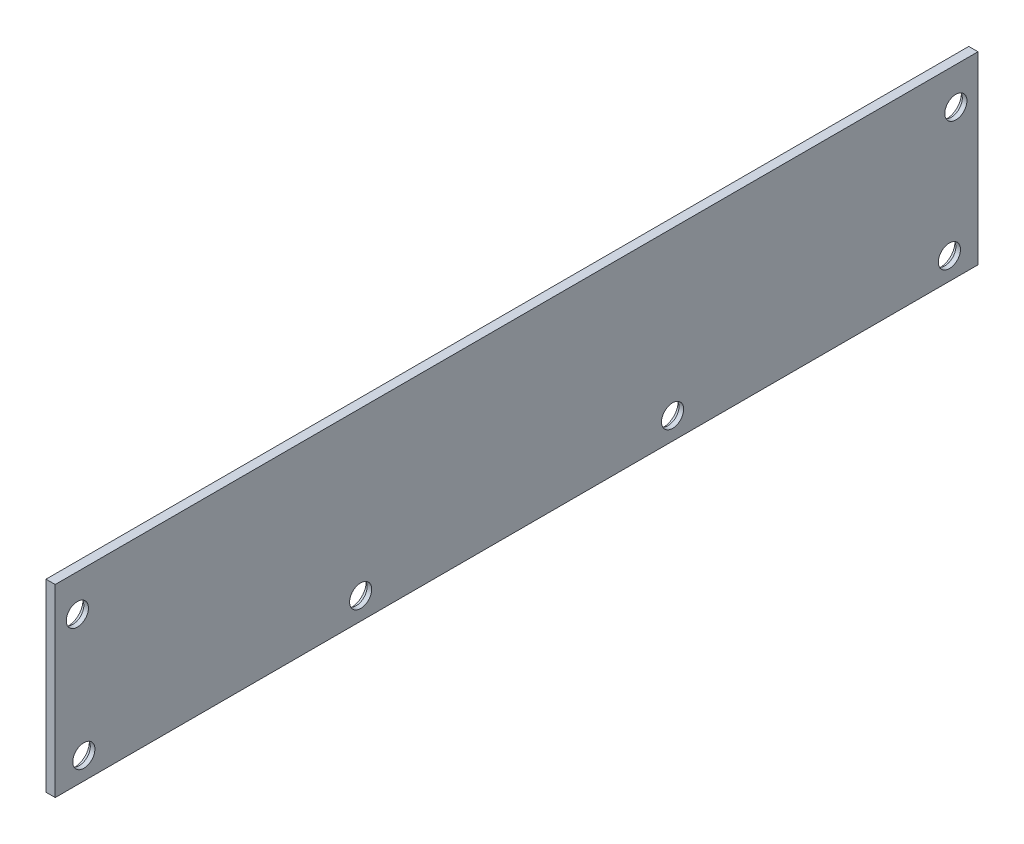
ISO-10303-21;
HEADER;
FILE_DESCRIPTION(('STEP AP214'),'2;1');
FILE_NAME('part.step','',(''),(''),'','','');
FILE_SCHEMA(('AUTOMOTIVE_DESIGN { 1 0 10303 214 1 1 1 1 }'));
ENDSEC;
DATA;
#1=APPLICATION_CONTEXT('core data for automotive mechanical design processes');
#2=APPLICATION_PROTOCOL_DEFINITION('international standard','automotive_design',2000,#1);
#3=PRODUCT_CONTEXT('',#1,'mechanical');
#4=PRODUCT('Part','Part','',(#3));
#5=PRODUCT_RELATED_PRODUCT_CATEGORY('part','',(#4));
#6=PRODUCT_DEFINITION_FORMATION('','',#4);
#7=PRODUCT_DEFINITION_CONTEXT('part definition',#1,'design');
#8=PRODUCT_DEFINITION('design','',#6,#7);
#9=PRODUCT_DEFINITION_SHAPE('','',#8);
#10=(LENGTH_UNIT() NAMED_UNIT(*) SI_UNIT(.MILLI.,.METRE.));
#11=(NAMED_UNIT(*) PLANE_ANGLE_UNIT() SI_UNIT($,.RADIAN.));
#12=(NAMED_UNIT(*) SI_UNIT($,.STERADIAN.) SOLID_ANGLE_UNIT());
#13=UNCERTAINTY_MEASURE_WITH_UNIT(LENGTH_MEASURE(1.E-05),#10,'distance_accuracy_value','');
#14=(GEOMETRIC_REPRESENTATION_CONTEXT(3) GLOBAL_UNCERTAINTY_ASSIGNED_CONTEXT((#13)) GLOBAL_UNIT_ASSIGNED_CONTEXT((#10,
#11,#12)) REPRESENTATION_CONTEXT('',''));
#15=CARTESIAN_POINT('',(0.,0.,0.));
#16=DIRECTION('',(0.,0.,1.));
#17=DIRECTION('',(1.,0.,0.));
#18=AXIS2_PLACEMENT_3D('',#15,#16,#17);
#19=CARTESIAN_POINT('',(-0.634999999999997,0.,-127.));
#20=DIRECTION('',(-1.,0.,0.));
#21=DIRECTION('',(0.,-1.,0.));
#22=AXIS2_PLACEMENT_3D('',#19,#20,#21);
#23=PLANE('',#22);
#24=CARTESIAN_POINT('',(-0.634999999999996,-5.08000000000001,-123.952));
#25=DIRECTION('',(-1.,0.,0.));
#26=DIRECTION('',(0.,-1.,0.));
#27=AXIS2_PLACEMENT_3D('',#24,#25,#26);
#28=CIRCLE('',#27,2.03200000000001);
#29=CARTESIAN_POINT('',(-0.634999999999996,-7.11200000000002,-123.952));
#30=VERTEX_POINT('',#29);
#31=EDGE_CURVE('E160',#30,#30,#28,.T.);
#32=ORIENTED_EDGE('',*,*,#31,.F.);
#33=EDGE_LOOP('',(#32));
#34=FACE_BOUND('',#33,.T.);
#35=CARTESIAN_POINT('',(-0.634999999999996,-5.08000000000001,-3.048));
#36=DIRECTION('',(-1.,0.,0.));
#37=DIRECTION('',(0.,-1.,0.));
#38=AXIS2_PLACEMENT_3D('',#35,#36,#37);
#39=CIRCLE('',#38,2.032);
#40=CARTESIAN_POINT('',(-0.634999999999996,-7.11200000000001,-3.048));
#41=VERTEX_POINT('',#40);
#42=EDGE_CURVE('E164',#41,#41,#39,.T.);
#43=ORIENTED_EDGE('',*,*,#42,.F.);
#44=EDGE_LOOP('',(#43));
#45=FACE_BOUND('',#44,.T.);
#46=CARTESIAN_POINT('',(-0.634999999999994,-22.352,-42.037));
#47=DIRECTION('',(-1.,0.,0.));
#48=DIRECTION('',(0.,-1.,0.));
#49=AXIS2_PLACEMENT_3D('',#46,#47,#48);
#50=CIRCLE('',#49,2.032);
#51=CARTESIAN_POINT('',(-0.634999999999994,-24.384,-42.037));
#52=VERTEX_POINT('',#51);
#53=EDGE_CURVE('E168',#52,#52,#50,.F.);
#54=ORIENTED_EDGE('',*,*,#53,.T.);
#55=EDGE_LOOP('',(#54));
#56=FACE_BOUND('',#55,.T.);
#57=CARTESIAN_POINT('',(-0.634999999999994,-22.352,-84.963));
#58=DIRECTION('',(-1.,0.,0.));
#59=DIRECTION('',(0.,-1.,0.));
#60=AXIS2_PLACEMENT_3D('',#57,#58,#59);
#61=CIRCLE('',#60,2.03200000000001);
#62=CARTESIAN_POINT('',(-0.634999999999994,-24.384,-84.963));
#63=VERTEX_POINT('',#62);
#64=EDGE_CURVE('E172',#63,#63,#61,.T.);
#65=ORIENTED_EDGE('',*,*,#64,.F.);
#66=EDGE_LOOP('',(#65));
#67=FACE_BOUND('',#66,.T.);
#68=CARTESIAN_POINT('',(-0.634999999999994,-22.352,-123.063));
#69=DIRECTION('',(-1.,0.,0.));
#70=DIRECTION('',(0.,-1.,0.));
#71=AXIS2_PLACEMENT_3D('',#68,#69,#70);
#72=CIRCLE('',#71,2.03200000000001);
#73=CARTESIAN_POINT('',(-0.634999999999994,-24.384,-123.063));
#74=VERTEX_POINT('',#73);
#75=EDGE_CURVE('E175',#74,#74,#72,.T.);
#76=ORIENTED_EDGE('',*,*,#75,.F.);
#77=EDGE_LOOP('',(#76));
#78=FACE_BOUND('',#77,.T.);
#79=DIRECTION('',(0.,-1.,0.));
#80=VECTOR('',#79,1.);
#81=CARTESIAN_POINT('',(-0.634999999999997,0.,0.));
#82=LINE('',#81,#80);
#83=CARTESIAN_POINT('',(-0.634999999999997,0.,0.));
#84=VERTEX_POINT('',#83);
#85=CARTESIAN_POINT('',(-0.634999999999994,-25.4,0.));
#86=VERTEX_POINT('',#85);
#87=EDGE_CURVE('E115',#84,#86,#82,.T.);
#88=ORIENTED_EDGE('',*,*,#87,.F.);
#89=DIRECTION('',(0.,0.,1.));
#90=VECTOR('',#89,1.);
#91=CARTESIAN_POINT('',(-0.634999999999997,0.,-127.));
#92=LINE('',#91,#90);
#93=CARTESIAN_POINT('',(-0.634999999999997,0.,-127.));
#94=VERTEX_POINT('',#93);
#95=EDGE_CURVE('E11',#94,#84,#92,.T.);
#96=ORIENTED_EDGE('',*,*,#95,.F.);
#97=DIRECTION('',(0.,-1.,0.));
#98=VECTOR('',#97,1.);
#99=CARTESIAN_POINT('',(-0.634999999999997,0.,-127.));
#100=LINE('',#99,#98);
#101=CARTESIAN_POINT('',(-0.634999999999994,-25.4,-127.));
#102=VERTEX_POINT('',#101);
#103=EDGE_CURVE('E106',#94,#102,#100,.T.);
#104=ORIENTED_EDGE('',*,*,#103,.T.);
#105=DIRECTION('',(0.,0.,1.));
#106=VECTOR('',#105,1.);
#107=CARTESIAN_POINT('',(-0.634999999999994,-25.4,-127.));
#108=LINE('',#107,#106);
#109=EDGE_CURVE('E86',#102,#86,#108,.T.);
#110=ORIENTED_EDGE('',*,*,#109,.T.);
#111=EDGE_LOOP('',(#88,#96,#104,#110));
#112=FACE_BOUND('',#111,.T.);
#113=CARTESIAN_POINT('',(-0.634999999999994,-22.352,-3.937));
#114=DIRECTION('',(-1.,0.,0.));
#115=DIRECTION('',(0.,-1.,0.));
#116=AXIS2_PLACEMENT_3D('',#113,#114,#115);
#117=CIRCLE('',#116,2.032);
#118=CARTESIAN_POINT('',(-0.634999999999994,-24.384,-3.937));
#119=VERTEX_POINT('',#118);
#120=EDGE_CURVE('E327',#119,#119,#117,.F.);
#121=ORIENTED_EDGE('',*,*,#120,.T.);
#122=EDGE_LOOP('',(#121));
#123=FACE_BOUND('',#122,.T.);
#124=ADVANCED_FACE('F42',(#34,#45,#56,#67,#78,#112,#123),#23,.T.);
#125=CARTESIAN_POINT('',(0.635000000000006,-22.352,-123.063));
#126=DIRECTION('',(-1.,0.,0.));
#127=DIRECTION('',(0.,-1.,0.));
#128=AXIS2_PLACEMENT_3D('',#125,#126,#127);
#129=CYLINDRICAL_SURFACE('',#128,1.52399999999999);
#130=CARTESIAN_POINT('',(0.635000000000006,-22.352,-123.063));
#131=DIRECTION('',(-1.,0.,0.));
#132=DIRECTION('',(0.,-1.,0.));
#133=AXIS2_PLACEMENT_3D('',#130,#131,#132);
#134=CIRCLE('',#133,1.52399999999999);
#135=CARTESIAN_POINT('',(0.635000000000006,-23.876,-123.063));
#136=VERTEX_POINT('',#135);
#137=EDGE_CURVE('E120',#136,#136,#134,.T.);
#138=ORIENTED_EDGE('',*,*,#137,.F.);
#139=EDGE_LOOP('',(#138));
#140=FACE_BOUND('',#139,.T.);
#141=CARTESIAN_POINT('',(0.,-22.352,-123.063));
#142=DIRECTION('',(-1.,0.,0.));
#143=DIRECTION('',(0.,-1.,0.));
#144=AXIS2_PLACEMENT_3D('',#141,#142,#143);
#145=CIRCLE('',#144,1.52399999999999);
#146=CARTESIAN_POINT('',(0.,-23.876,-123.063));
#147=VERTEX_POINT('',#146);
#148=EDGE_CURVE('E178',#147,#147,#145,.F.);
#149=ORIENTED_EDGE('',*,*,#148,.F.);
#150=EDGE_LOOP('',(#149));
#151=FACE_BOUND('',#150,.T.);
#152=ADVANCED_FACE('F149',(#140,#151),#129,.F.);
#153=CARTESIAN_POINT('',(0.635000000000004,-5.08000000000001,-3.048));
#154=DIRECTION('',(-1.,0.,0.));
#155=DIRECTION('',(0.,-1.,0.));
#156=AXIS2_PLACEMENT_3D('',#153,#154,#155);
#157=CYLINDRICAL_SURFACE('',#156,1.52399999999999);
#158=CARTESIAN_POINT('',(0.635000000000004,-5.08000000000001,-3.048));
#159=DIRECTION('',(-1.,0.,0.));
#160=DIRECTION('',(0.,1.,0.));
#161=AXIS2_PLACEMENT_3D('',#158,#159,#160);
#162=CIRCLE('',#161,1.52399999999999);
#163=CARTESIAN_POINT('',(0.635000000000004,-3.55600000000002,-3.048));
#164=VERTEX_POINT('',#163);
#165=EDGE_CURVE('E189',#164,#164,#162,.T.);
#166=ORIENTED_EDGE('',*,*,#165,.F.);
#167=EDGE_LOOP('',(#166));
#168=FACE_BOUND('',#167,.T.);
#169=CARTESIAN_POINT('',(0.,-5.08000000000001,-3.048));
#170=DIRECTION('',(-1.,0.,0.));
#171=DIRECTION('',(0.,-1.,0.));
#172=AXIS2_PLACEMENT_3D('',#169,#170,#171);
#173=CIRCLE('',#172,1.52399999999999);
#174=CARTESIAN_POINT('',(0.,-6.604,-3.048));
#175=VERTEX_POINT('',#174);
#176=EDGE_CURVE('E304',#175,#175,#173,.F.);
#177=ORIENTED_EDGE('',*,*,#176,.F.);
#178=EDGE_LOOP('',(#177));
#179=FACE_BOUND('',#178,.T.);
#180=ADVANCED_FACE('F154',(#168,#179),#157,.F.);
#181=CARTESIAN_POINT('',(0.635000000000006,-22.352,-3.937));
#182=DIRECTION('',(-1.,0.,0.));
#183=DIRECTION('',(0.,-1.,0.));
#184=AXIS2_PLACEMENT_3D('',#181,#182,#183);
#185=CYLINDRICAL_SURFACE('',#184,1.52399999999999);
#186=CARTESIAN_POINT('',(0.635000000000006,-22.352,-3.937));
#187=DIRECTION('',(-1.,0.,0.));
#188=DIRECTION('',(0.,1.,0.));
#189=AXIS2_PLACEMENT_3D('',#186,#187,#188);
#190=CIRCLE('',#189,1.52399999999999);
#191=CARTESIAN_POINT('',(0.635000000000006,-20.828,-3.937));
#192=VERTEX_POINT('',#191);
#193=EDGE_CURVE('E193',#192,#192,#190,.T.);
#194=ORIENTED_EDGE('',*,*,#193,.F.);
#195=EDGE_LOOP('',(#194));
#196=FACE_BOUND('',#195,.T.);
#197=CARTESIAN_POINT('',(0.,-22.352,-3.937));
#198=DIRECTION('',(-1.,0.,0.));
#199=DIRECTION('',(0.,-1.,0.));
#200=AXIS2_PLACEMENT_3D('',#197,#198,#199);
#201=CIRCLE('',#200,1.52399999999999);
#202=CARTESIAN_POINT('',(0.,-23.876,-3.937));
#203=VERTEX_POINT('',#202);
#204=EDGE_CURVE('E310',#203,#203,#201,.F.);
#205=ORIENTED_EDGE('',*,*,#204,.F.);
#206=EDGE_LOOP('',(#205));
#207=FACE_BOUND('',#206,.T.);
#208=ADVANCED_FACE('F237',(#196,#207),#185,.F.);
#209=CARTESIAN_POINT('',(0.635000000000006,-22.352,-42.037));
#210=DIRECTION('',(-1.,0.,0.));
#211=DIRECTION('',(0.,-1.,0.));
#212=AXIS2_PLACEMENT_3D('',#209,#210,#211);
#213=CYLINDRICAL_SURFACE('',#212,1.52399999999999);
#214=CARTESIAN_POINT('',(0.635000000000006,-22.352,-42.037));
#215=DIRECTION('',(-1.,0.,0.));
#216=DIRECTION('',(0.,1.,0.));
#217=AXIS2_PLACEMENT_3D('',#214,#215,#216);
#218=CIRCLE('',#217,1.52399999999999);
#219=CARTESIAN_POINT('',(0.635000000000006,-20.828,-42.037));
#220=VERTEX_POINT('',#219);
#221=EDGE_CURVE('E202',#220,#220,#218,.T.);
#222=ORIENTED_EDGE('',*,*,#221,.F.);
#223=EDGE_LOOP('',(#222));
#224=FACE_BOUND('',#223,.T.);
#225=CARTESIAN_POINT('',(0.,-22.352,-42.037));
#226=DIRECTION('',(-1.,0.,0.));
#227=DIRECTION('',(0.,-1.,0.));
#228=AXIS2_PLACEMENT_3D('',#225,#226,#227);
#229=CIRCLE('',#228,1.52399999999999);
#230=CARTESIAN_POINT('',(0.,-23.876,-42.037));
#231=VERTEX_POINT('',#230);
#232=EDGE_CURVE('E334',#231,#231,#229,.F.);
#233=ORIENTED_EDGE('',*,*,#232,.F.);
#234=EDGE_LOOP('',(#233));
#235=FACE_BOUND('',#234,.T.);
#236=ADVANCED_FACE('F231',(#224,#235),#213,.F.);
#237=CARTESIAN_POINT('',(0.635000000000004,-5.08000000000001,-123.952));
#238=DIRECTION('',(-1.,0.,0.));
#239=DIRECTION('',(0.,-1.,0.));
#240=AXIS2_PLACEMENT_3D('',#237,#238,#239);
#241=CYLINDRICAL_SURFACE('',#240,1.52399999999999);
#242=CARTESIAN_POINT('',(0.635000000000004,-5.08000000000001,-123.952));
#243=DIRECTION('',(-1.,0.,0.));
#244=DIRECTION('',(0.,-1.,0.));
#245=AXIS2_PLACEMENT_3D('',#242,#243,#244);
#246=CIRCLE('',#245,1.52399999999999);
#247=CARTESIAN_POINT('',(0.635000000000004,-6.604,-123.952));
#248=VERTEX_POINT('',#247);
#249=EDGE_CURVE('E198',#248,#248,#246,.T.);
#250=ORIENTED_EDGE('',*,*,#249,.F.);
#251=EDGE_LOOP('',(#250));
#252=FACE_BOUND('',#251,.T.);
#253=CARTESIAN_POINT('',(0.,-5.08000000000001,-123.952));
#254=DIRECTION('',(-1.,0.,0.));
#255=DIRECTION('',(0.,-1.,0.));
#256=AXIS2_PLACEMENT_3D('',#253,#254,#255);
#257=CIRCLE('',#256,1.52399999999999);
#258=CARTESIAN_POINT('',(0.,-6.604,-123.952));
#259=VERTEX_POINT('',#258);
#260=EDGE_CURVE('E45',#259,#259,#257,.F.);
#261=ORIENTED_EDGE('',*,*,#260,.F.);
#262=EDGE_LOOP('',(#261));
#263=FACE_BOUND('',#262,.T.);
#264=ADVANCED_FACE('F144',(#252,#263),#241,.F.);
#265=CARTESIAN_POINT('',(0.635000000000006,-22.352,-84.963));
#266=DIRECTION('',(-1.,0.,0.));
#267=DIRECTION('',(0.,-1.,0.));
#268=AXIS2_PLACEMENT_3D('',#265,#266,#267);
#269=CYLINDRICAL_SURFACE('',#268,1.52399999999999);
#270=CARTESIAN_POINT('',(0.635000000000006,-22.352,-84.963));
#271=DIRECTION('',(-1.,0.,0.));
#272=DIRECTION('',(0.,-1.,0.));
#273=AXIS2_PLACEMENT_3D('',#270,#271,#272);
#274=CIRCLE('',#273,1.52399999999999);
#275=CARTESIAN_POINT('',(0.635000000000006,-23.876,-84.963));
#276=VERTEX_POINT('',#275);
#277=EDGE_CURVE('E194',#276,#276,#274,.T.);
#278=ORIENTED_EDGE('',*,*,#277,.F.);
#279=EDGE_LOOP('',(#278));
#280=FACE_BOUND('',#279,.T.);
#281=CARTESIAN_POINT('',(0.,-22.352,-84.963));
#282=DIRECTION('',(-1.,0.,0.));
#283=DIRECTION('',(0.,-1.,0.));
#284=AXIS2_PLACEMENT_3D('',#281,#282,#283);
#285=CIRCLE('',#284,1.52399999999999);
#286=CARTESIAN_POINT('',(0.,-23.876,-84.963));
#287=VERTEX_POINT('',#286);
#288=EDGE_CURVE('E185',#287,#287,#285,.F.);
#289=ORIENTED_EDGE('',*,*,#288,.F.);
#290=EDGE_LOOP('',(#289));
#291=FACE_BOUND('',#290,.T.);
#292=ADVANCED_FACE('F135',(#280,#291),#269,.F.);
#293=CARTESIAN_POINT('',(-0.634999999999997,0.,-127.));
#294=DIRECTION('',(0.,1.,0.));
#295=DIRECTION('',(0.,0.,1.));
#296=AXIS2_PLACEMENT_3D('',#293,#294,#295);
#297=PLANE('',#296);
#298=DIRECTION('',(-1.,0.,0.));
#299=VECTOR('',#298,1.);
#300=CARTESIAN_POINT('',(-0.634999999999997,0.,0.));
#301=LINE('',#300,#299);
#302=CARTESIAN_POINT('',(0.635000000000003,0.,0.));
#303=VERTEX_POINT('',#302);
#304=EDGE_CURVE('E109',#303,#84,#301,.T.);
#305=ORIENTED_EDGE('',*,*,#304,.F.);
#306=DIRECTION('',(0.,0.,1.));
#307=VECTOR('',#306,1.);
#308=CARTESIAN_POINT('',(0.635000000000003,0.,-127.));
#309=LINE('',#308,#307);
#310=CARTESIAN_POINT('',(0.635000000000003,0.,-127.));
#311=VERTEX_POINT('',#310);
#312=EDGE_CURVE('E52',#311,#303,#309,.T.);
#313=ORIENTED_EDGE('',*,*,#312,.F.);
#314=DIRECTION('',(-1.,0.,0.));
#315=VECTOR('',#314,1.);
#316=CARTESIAN_POINT('',(-0.634999999999997,0.,-127.));
#317=LINE('',#316,#315);
#318=EDGE_CURVE('E101',#311,#94,#317,.T.);
#319=ORIENTED_EDGE('',*,*,#318,.T.);
#320=ORIENTED_EDGE('',*,*,#95,.T.);
#321=EDGE_LOOP('',(#305,#313,#319,#320));
#322=FACE_BOUND('',#321,.T.);
#323=ADVANCED_FACE('F133',(#322),#297,.T.);
#324=CARTESIAN_POINT('',(0.635000000000003,0.,-127.));
#325=DIRECTION('',(1.,0.,0.));
#326=DIRECTION('',(0.,1.,0.));
#327=AXIS2_PLACEMENT_3D('',#324,#325,#326);
#328=PLANE('',#327);
#329=ORIENTED_EDGE('',*,*,#277,.T.);
#330=EDGE_LOOP('',(#329));
#331=FACE_BOUND('',#330,.T.);
#332=ORIENTED_EDGE('',*,*,#249,.T.);
#333=EDGE_LOOP('',(#332));
#334=FACE_BOUND('',#333,.T.);
#335=ORIENTED_EDGE('',*,*,#221,.T.);
#336=EDGE_LOOP('',(#335));
#337=FACE_BOUND('',#336,.T.);
#338=ORIENTED_EDGE('',*,*,#193,.T.);
#339=EDGE_LOOP('',(#338));
#340=FACE_BOUND('',#339,.T.);
#341=ORIENTED_EDGE('',*,*,#165,.T.);
#342=EDGE_LOOP('',(#341));
#343=FACE_BOUND('',#342,.T.);
#344=ORIENTED_EDGE('',*,*,#137,.T.);
#345=EDGE_LOOP('',(#344));
#346=FACE_BOUND('',#345,.T.);
#347=DIRECTION('',(0.,1.,0.));
#348=VECTOR('',#347,1.);
#349=CARTESIAN_POINT('',(0.635000000000003,0.,0.));
#350=LINE('',#349,#348);
#351=CARTESIAN_POINT('',(0.635000000000006,-25.4,0.));
#352=VERTEX_POINT('',#351);
#353=EDGE_CURVE('E94',#352,#303,#350,.T.);
#354=ORIENTED_EDGE('',*,*,#353,.F.);
#355=DIRECTION('',(0.,0.,1.));
#356=VECTOR('',#355,1.);
#357=CARTESIAN_POINT('',(0.635000000000006,-25.4,-127.));
#358=LINE('',#357,#356);
#359=CARTESIAN_POINT('',(0.635000000000006,-25.4,-127.));
#360=VERTEX_POINT('',#359);
#361=EDGE_CURVE('E89',#360,#352,#358,.T.);
#362=ORIENTED_EDGE('',*,*,#361,.F.);
#363=DIRECTION('',(0.,1.,0.));
#364=VECTOR('',#363,1.);
#365=CARTESIAN_POINT('',(0.635000000000003,0.,-127.));
#366=LINE('',#365,#364);
#367=EDGE_CURVE('E92',#360,#311,#366,.T.);
#368=ORIENTED_EDGE('',*,*,#367,.T.);
#369=ORIENTED_EDGE('',*,*,#312,.T.);
#370=EDGE_LOOP('',(#354,#362,#368,#369));
#371=FACE_BOUND('',#370,.T.);
#372=ADVANCED_FACE('F91',(#331,#334,#337,#340,#343,#346,#371),#328,.T.);
#373=CARTESIAN_POINT('',(-0.634999999999994,-25.4,-127.));
#374=DIRECTION('',(0.,-1.,0.));
#375=DIRECTION('',(1.,0.,0.));
#376=AXIS2_PLACEMENT_3D('',#373,#374,#375);
#377=PLANE('',#376);
#378=DIRECTION('',(1.,0.,0.));
#379=VECTOR('',#378,1.);
#380=CARTESIAN_POINT('',(-0.634999999999994,-25.4,0.));
#381=LINE('',#380,#379);
#382=EDGE_CURVE('E119',#86,#352,#381,.T.);
#383=ORIENTED_EDGE('',*,*,#382,.F.);
#384=ORIENTED_EDGE('',*,*,#109,.F.);
#385=DIRECTION('',(1.,0.,0.));
#386=VECTOR('',#385,1.);
#387=CARTESIAN_POINT('',(-0.634999999999994,-25.4,-127.));
#388=LINE('',#387,#386);
#389=EDGE_CURVE('E100',#102,#360,#388,.T.);
#390=ORIENTED_EDGE('',*,*,#389,.T.);
#391=ORIENTED_EDGE('',*,*,#361,.T.);
#392=EDGE_LOOP('',(#383,#384,#390,#391));
#393=FACE_BOUND('',#392,.T.);
#394=ADVANCED_FACE('F104',(#393),#377,.T.);
#395=CARTESIAN_POINT('',(0.,0.,-127.));
#396=DIRECTION('',(0.,0.,1.));
#397=DIRECTION('',(1.,0.,0.));
#398=AXIS2_PLACEMENT_3D('',#395,#396,#397);
#399=PLANE('',#398);
#400=ORIENTED_EDGE('',*,*,#103,.F.);
#401=ORIENTED_EDGE('',*,*,#318,.F.);
#402=ORIENTED_EDGE('',*,*,#367,.F.);
#403=ORIENTED_EDGE('',*,*,#389,.F.);
#404=EDGE_LOOP('',(#400,#401,#402,#403));
#405=FACE_BOUND('',#404,.T.);
#406=ADVANCED_FACE('F99',(#405),#399,.F.);
#407=CARTESIAN_POINT('',(0.,0.,0.));
#408=DIRECTION('',(0.,0.,1.));
#409=DIRECTION('',(1.,0.,0.));
#410=AXIS2_PLACEMENT_3D('',#407,#408,#409);
#411=PLANE('',#410);
#412=ORIENTED_EDGE('',*,*,#87,.T.);
#413=ORIENTED_EDGE('',*,*,#382,.T.);
#414=ORIENTED_EDGE('',*,*,#353,.T.);
#415=ORIENTED_EDGE('',*,*,#304,.T.);
#416=EDGE_LOOP('',(#412,#413,#414,#415));
#417=FACE_BOUND('',#416,.T.);
#418=ADVANCED_FACE('F132',(#417),#411,.T.);
#419=CARTESIAN_POINT('',(0.,-22.352,-84.963));
#420=DIRECTION('',(-1.,0.,0.));
#421=DIRECTION('',(0.,-1.,0.));
#422=AXIS2_PLACEMENT_3D('',#419,#420,#421);
#423=CYLINDRICAL_SURFACE('',#422,2.03200000000001);
#424=CARTESIAN_POINT('',(0.,-22.352,-84.963));
#425=DIRECTION('',(-1.,0.,0.));
#426=DIRECTION('',(0.,-1.,0.));
#427=AXIS2_PLACEMENT_3D('',#424,#425,#426);
#428=CIRCLE('',#427,2.03200000000001);
#429=CARTESIAN_POINT('',(0.,-24.384,-84.963));
#430=VERTEX_POINT('',#429);
#431=EDGE_CURVE('E344',#430,#430,#428,.T.);
#432=ORIENTED_EDGE('',*,*,#431,.F.);
#433=EDGE_LOOP('',(#432));
#434=FACE_BOUND('',#433,.T.);
#435=ORIENTED_EDGE('',*,*,#64,.T.);
#436=EDGE_LOOP('',(#435));
#437=FACE_BOUND('',#436,.T.);
#438=ADVANCED_FACE('F248',(#434,#437),#423,.F.);
#439=CARTESIAN_POINT('',(0.,0.,0.));
#440=DIRECTION('',(-1.,0.,0.));
#441=DIRECTION('',(0.,-1.,0.));
#442=AXIS2_PLACEMENT_3D('',#439,#440,#441);
#443=PLANE('',#442);
#444=ORIENTED_EDGE('',*,*,#288,.T.);
#445=EDGE_LOOP('',(#444));
#446=FACE_BOUND('',#445,.T.);
#447=ORIENTED_EDGE('',*,*,#431,.T.);
#448=EDGE_LOOP('',(#447));
#449=FACE_BOUND('',#448,.T.);
#450=ADVANCED_FACE('F253',(#446,#449),#443,.T.);
#451=CARTESIAN_POINT('',(0.,-5.08000000000001,-123.952));
#452=DIRECTION('',(-1.,0.,0.));
#453=DIRECTION('',(0.,-1.,0.));
#454=AXIS2_PLACEMENT_3D('',#451,#452,#453);
#455=PLANE('',#454);
#456=CARTESIAN_POINT('',(0.,-5.08000000000001,-123.952));
#457=DIRECTION('',(-1.,0.,0.));
#458=DIRECTION('',(0.,-1.,0.));
#459=AXIS2_PLACEMENT_3D('',#456,#457,#458);
#460=CIRCLE('',#459,2.03200000000001);
#461=CARTESIAN_POINT('',(0.,-7.11200000000002,-123.952));
#462=VERTEX_POINT('',#461);
#463=EDGE_CURVE('E317',#462,#462,#460,.T.);
#464=ORIENTED_EDGE('',*,*,#463,.T.);
#465=EDGE_LOOP('',(#464));
#466=FACE_BOUND('',#465,.T.);
#467=ORIENTED_EDGE('',*,*,#260,.T.);
#468=EDGE_LOOP('',(#467));
#469=FACE_BOUND('',#468,.T.);
#470=ADVANCED_FACE('F228',(#466,#469),#455,.T.);
#471=CARTESIAN_POINT('',(0.,-5.08000000000001,-123.952));
#472=DIRECTION('',(-1.,0.,0.));
#473=DIRECTION('',(0.,-1.,0.));
#474=AXIS2_PLACEMENT_3D('',#471,#472,#473);
#475=CYLINDRICAL_SURFACE('',#474,2.03200000000001);
#476=ORIENTED_EDGE('',*,*,#463,.F.);
#477=EDGE_LOOP('',(#476));
#478=FACE_BOUND('',#477,.T.);
#479=ORIENTED_EDGE('',*,*,#31,.T.);
#480=EDGE_LOOP('',(#479));
#481=FACE_BOUND('',#480,.T.);
#482=ADVANCED_FACE('F268',(#478,#481),#475,.F.);
#483=CARTESIAN_POINT('',(0.,-22.352,-42.037));
#484=DIRECTION('',(-1.,0.,0.));
#485=DIRECTION('',(0.,-1.,0.));
#486=AXIS2_PLACEMENT_3D('',#483,#484,#485);
#487=CYLINDRICAL_SURFACE('',#486,2.032);
#488=CARTESIAN_POINT('',(0.,-22.352,-42.037));
#489=DIRECTION('',(-1.,0.,0.));
#490=DIRECTION('',(0.,-1.,0.));
#491=AXIS2_PLACEMENT_3D('',#488,#489,#490);
#492=CIRCLE('',#491,2.032);
#493=CARTESIAN_POINT('',(0.,-24.384,-42.037));
#494=VERTEX_POINT('',#493);
#495=EDGE_CURVE('E335',#494,#494,#492,.F.);
#496=ORIENTED_EDGE('',*,*,#495,.T.);
#497=EDGE_LOOP('',(#496));
#498=FACE_BOUND('',#497,.T.);
#499=ORIENTED_EDGE('',*,*,#53,.F.);
#500=EDGE_LOOP('',(#499));
#501=FACE_BOUND('',#500,.T.);
#502=ADVANCED_FACE('F264',(#498,#501),#487,.F.);
#503=CARTESIAN_POINT('',(0.,0.,0.));
#504=DIRECTION('',(-1.,0.,0.));
#505=DIRECTION('',(0.,-1.,0.));
#506=AXIS2_PLACEMENT_3D('',#503,#504,#505);
#507=PLANE('',#506);
#508=ORIENTED_EDGE('',*,*,#495,.F.);
#509=EDGE_LOOP('',(#508));
#510=FACE_BOUND('',#509,.T.);
#511=ORIENTED_EDGE('',*,*,#232,.T.);
#512=EDGE_LOOP('',(#511));
#513=FACE_BOUND('',#512,.T.);
#514=ADVANCED_FACE('F267',(#510,#513),#507,.T.);
#515=CARTESIAN_POINT('',(0.,-22.352,-3.937));
#516=DIRECTION('',(-1.,0.,0.));
#517=DIRECTION('',(0.,-1.,0.));
#518=AXIS2_PLACEMENT_3D('',#515,#516,#517);
#519=CYLINDRICAL_SURFACE('',#518,2.032);
#520=CARTESIAN_POINT('',(0.,-22.352,-3.937));
#521=DIRECTION('',(-1.,0.,0.));
#522=DIRECTION('',(0.,-1.,0.));
#523=AXIS2_PLACEMENT_3D('',#520,#521,#522);
#524=CIRCLE('',#523,2.032);
#525=CARTESIAN_POINT('',(0.,-24.384,-3.937));
#526=VERTEX_POINT('',#525);
#527=EDGE_CURVE('E323',#526,#526,#524,.F.);
#528=ORIENTED_EDGE('',*,*,#527,.T.);
#529=EDGE_LOOP('',(#528));
#530=FACE_BOUND('',#529,.T.);
#531=ORIENTED_EDGE('',*,*,#120,.F.);
#532=EDGE_LOOP('',(#531));
#533=FACE_BOUND('',#532,.T.);
#534=ADVANCED_FACE('F272',(#530,#533),#519,.F.);
#535=CARTESIAN_POINT('',(0.,0.,0.));
#536=DIRECTION('',(-1.,0.,0.));
#537=DIRECTION('',(0.,-1.,0.));
#538=AXIS2_PLACEMENT_3D('',#535,#536,#537);
#539=PLANE('',#538);
#540=ORIENTED_EDGE('',*,*,#527,.F.);
#541=EDGE_LOOP('',(#540));
#542=FACE_BOUND('',#541,.T.);
#543=ORIENTED_EDGE('',*,*,#204,.T.);
#544=EDGE_LOOP('',(#543));
#545=FACE_BOUND('',#544,.T.);
#546=ADVANCED_FACE('F276',(#542,#545),#539,.T.);
#547=CARTESIAN_POINT('',(0.,-5.08000000000001,-3.048));
#548=DIRECTION('',(-1.,0.,0.));
#549=DIRECTION('',(0.,-1.,0.));
#550=AXIS2_PLACEMENT_3D('',#547,#548,#549);
#551=CYLINDRICAL_SURFACE('',#550,2.032);
#552=CARTESIAN_POINT('',(0.,-5.08000000000001,-3.048));
#553=DIRECTION('',(-1.,0.,0.));
#554=DIRECTION('',(0.,-1.,0.));
#555=AXIS2_PLACEMENT_3D('',#552,#553,#554);
#556=CIRCLE('',#555,2.032);
#557=CARTESIAN_POINT('',(0.,-7.11200000000001,-3.048));
#558=VERTEX_POINT('',#557);
#559=EDGE_CURVE('E306',#558,#558,#556,.T.);
#560=ORIENTED_EDGE('',*,*,#559,.F.);
#561=EDGE_LOOP('',(#560));
#562=FACE_BOUND('',#561,.T.);
#563=ORIENTED_EDGE('',*,*,#42,.T.);
#564=EDGE_LOOP('',(#563));
#565=FACE_BOUND('',#564,.T.);
#566=ADVANCED_FACE('F280',(#562,#565),#551,.F.);
#567=CARTESIAN_POINT('',(0.,0.,0.));
#568=DIRECTION('',(-1.,0.,0.));
#569=DIRECTION('',(0.,-1.,0.));
#570=AXIS2_PLACEMENT_3D('',#567,#568,#569);
#571=PLANE('',#570);
#572=ORIENTED_EDGE('',*,*,#176,.T.);
#573=EDGE_LOOP('',(#572));
#574=FACE_BOUND('',#573,.T.);
#575=ORIENTED_EDGE('',*,*,#559,.T.);
#576=EDGE_LOOP('',(#575));
#577=FACE_BOUND('',#576,.T.);
#578=ADVANCED_FACE('F284',(#574,#577),#571,.T.);
#579=CARTESIAN_POINT('',(0.,-22.352,-123.063));
#580=DIRECTION('',(-1.,0.,0.));
#581=DIRECTION('',(0.,-1.,0.));
#582=AXIS2_PLACEMENT_3D('',#579,#580,#581);
#583=CYLINDRICAL_SURFACE('',#582,2.03200000000001);
#584=CARTESIAN_POINT('',(0.,-22.352,-123.063));
#585=DIRECTION('',(-1.,0.,0.));
#586=DIRECTION('',(0.,-1.,0.));
#587=AXIS2_PLACEMENT_3D('',#584,#585,#586);
#588=CIRCLE('',#587,2.03200000000001);
#589=CARTESIAN_POINT('',(0.,-24.384,-123.063));
#590=VERTEX_POINT('',#589);
#591=EDGE_CURVE('E183',#590,#590,#588,.T.);
#592=ORIENTED_EDGE('',*,*,#591,.F.);
#593=EDGE_LOOP('',(#592));
#594=FACE_BOUND('',#593,.T.);
#595=ORIENTED_EDGE('',*,*,#75,.T.);
#596=EDGE_LOOP('',(#595));
#597=FACE_BOUND('',#596,.T.);
#598=ADVANCED_FACE('F218',(#594,#597),#583,.F.);
#599=CARTESIAN_POINT('',(0.,0.,0.));
#600=DIRECTION('',(-1.,0.,0.));
#601=DIRECTION('',(0.,-1.,0.));
#602=AXIS2_PLACEMENT_3D('',#599,#600,#601);
#603=PLANE('',#602);
#604=ORIENTED_EDGE('',*,*,#148,.T.);
#605=EDGE_LOOP('',(#604));
#606=FACE_BOUND('',#605,.T.);
#607=ORIENTED_EDGE('',*,*,#591,.T.);
#608=EDGE_LOOP('',(#607));
#609=FACE_BOUND('',#608,.T.);
#610=ADVANCED_FACE('F215',(#606,#609),#603,.T.);
#611=CLOSED_SHELL('',(#124,#152,#180,#208,#236,#264,#292,#323,#372,#394,#406,#418,#438,#450,
#470,#482,#502,#514,#534,#546,#566,#578,#598,#610));
#612=MANIFOLD_SOLID_BREP('B2',#611);
#613=ADVANCED_BREP_SHAPE_REPRESENTATION('',(#18,#612),#14);
#614=SHAPE_DEFINITION_REPRESENTATION(#9,#613);
ENDSEC;
END-ISO-10303-21;
